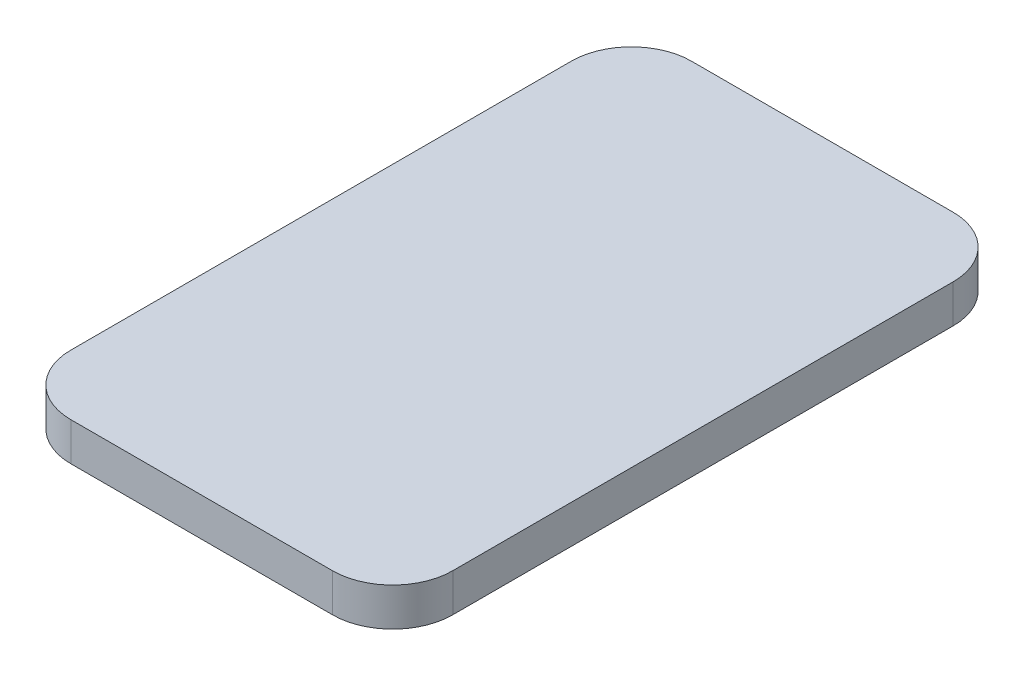
ISO-10303-21;
HEADER;
FILE_DESCRIPTION(('STEP AP214'),'2;1');
FILE_NAME('part.step','',(''),(''),'','','');
FILE_SCHEMA(('AUTOMOTIVE_DESIGN { 1 0 10303 214 1 1 1 1 }'));
ENDSEC;
DATA;
#1=APPLICATION_CONTEXT('core data for automotive mechanical design processes');
#2=APPLICATION_PROTOCOL_DEFINITION('international standard','automotive_design',2000,#1);
#3=PRODUCT_CONTEXT('',#1,'mechanical');
#4=PRODUCT('Part','Part','',(#3));
#5=PRODUCT_RELATED_PRODUCT_CATEGORY('part','',(#4));
#6=PRODUCT_DEFINITION_FORMATION('','',#4);
#7=PRODUCT_DEFINITION_CONTEXT('part definition',#1,'design');
#8=PRODUCT_DEFINITION('design','',#6,#7);
#9=PRODUCT_DEFINITION_SHAPE('','',#8);
#10=(LENGTH_UNIT() NAMED_UNIT(*) SI_UNIT(.MILLI.,.METRE.));
#11=(NAMED_UNIT(*) PLANE_ANGLE_UNIT() SI_UNIT($,.RADIAN.));
#12=(NAMED_UNIT(*) SI_UNIT($,.STERADIAN.) SOLID_ANGLE_UNIT());
#13=UNCERTAINTY_MEASURE_WITH_UNIT(LENGTH_MEASURE(1.E-05),#10,'distance_accuracy_value','');
#14=(GEOMETRIC_REPRESENTATION_CONTEXT(3) GLOBAL_UNCERTAINTY_ASSIGNED_CONTEXT((#13)) GLOBAL_UNIT_ASSIGNED_CONTEXT((#10,
#11,#12)) REPRESENTATION_CONTEXT('',''));
#15=CARTESIAN_POINT('',(0.,0.,0.));
#16=DIRECTION('',(0.,0.,1.));
#17=DIRECTION('',(1.,0.,0.));
#18=AXIS2_PLACEMENT_3D('',#15,#16,#17);
#19=CARTESIAN_POINT('',(27.4,8.,-52.4));
#20=DIRECTION('',(0.,-1.,0.));
#21=DIRECTION('',(0.,0.,-1.));
#22=AXIS2_PLACEMENT_3D('',#19,#20,#21);
#23=CYLINDRICAL_SURFACE('',#22,12.6);
#24=CARTESIAN_POINT('',(27.4,0.,-52.4));
#25=DIRECTION('',(0.,1.,0.));
#26=DIRECTION('',(0.,0.,1.));
#27=AXIS2_PLACEMENT_3D('',#24,#25,#26);
#28=CIRCLE('',#27,12.6);
#29=CARTESIAN_POINT('',(40.,0.,-52.4));
#30=VERTEX_POINT('',#29);
#31=CARTESIAN_POINT('',(27.4,0.,-65.));
#32=VERTEX_POINT('',#31);
#33=EDGE_CURVE('E132',#30,#32,#28,.T.);
#34=ORIENTED_EDGE('',*,*,#33,.T.);
#35=DIRECTION('',(0.,-1.,0.));
#36=VECTOR('',#35,1.);
#37=CARTESIAN_POINT('',(27.4,8.,-65.));
#38=LINE('',#37,#36);
#39=CARTESIAN_POINT('',(27.4,8.,-65.));
#40=VERTEX_POINT('',#39);
#41=EDGE_CURVE('E11',#40,#32,#38,.T.);
#42=ORIENTED_EDGE('',*,*,#41,.F.);
#43=CARTESIAN_POINT('',(27.4,8.,-52.4));
#44=DIRECTION('',(0.,1.,0.));
#45=DIRECTION('',(0.,0.,1.));
#46=AXIS2_PLACEMENT_3D('',#43,#44,#45);
#47=CIRCLE('',#46,12.6);
#48=CARTESIAN_POINT('',(40.,8.,-52.4));
#49=VERTEX_POINT('',#48);
#50=EDGE_CURVE('E146',#49,#40,#47,.T.);
#51=ORIENTED_EDGE('',*,*,#50,.F.);
#52=DIRECTION('',(0.,-1.,0.));
#53=VECTOR('',#52,1.);
#54=CARTESIAN_POINT('',(40.,8.,-52.4));
#55=LINE('',#54,#53);
#56=EDGE_CURVE('E128',#49,#30,#55,.T.);
#57=ORIENTED_EDGE('',*,*,#56,.T.);
#58=EDGE_LOOP('',(#34,#42,#51,#57));
#59=FACE_BOUND('',#58,.T.);
#60=ADVANCED_FACE('F36',(#59),#23,.T.);
#61=CARTESIAN_POINT('',(27.4,8.,-65.));
#62=DIRECTION('',(0.,0.,1.));
#63=DIRECTION('',(1.,0.,0.));
#64=AXIS2_PLACEMENT_3D('',#61,#62,#63);
#65=PLANE('',#64);
#66=DIRECTION('',(-1.,0.,0.));
#67=VECTOR('',#66,1.);
#68=CARTESIAN_POINT('',(27.4,0.,-65.));
#69=LINE('',#68,#67);
#70=CARTESIAN_POINT('',(-27.4,0.,-65.));
#71=VERTEX_POINT('',#70);
#72=EDGE_CURVE('E135',#32,#71,#69,.T.);
#73=ORIENTED_EDGE('',*,*,#72,.T.);
#74=DIRECTION('',(0.,-1.,0.));
#75=VECTOR('',#74,1.);
#76=CARTESIAN_POINT('',(-27.4,8.,-65.));
#77=LINE('',#76,#75);
#78=CARTESIAN_POINT('',(-27.4,8.,-65.));
#79=VERTEX_POINT('',#78);
#80=EDGE_CURVE('E44',#79,#71,#77,.T.);
#81=ORIENTED_EDGE('',*,*,#80,.F.);
#82=DIRECTION('',(-1.,0.,0.));
#83=VECTOR('',#82,1.);
#84=CARTESIAN_POINT('',(27.4,8.,-65.));
#85=LINE('',#84,#83);
#86=EDGE_CURVE('E95',#40,#79,#85,.T.);
#87=ORIENTED_EDGE('',*,*,#86,.F.);
#88=ORIENTED_EDGE('',*,*,#41,.T.);
#89=EDGE_LOOP('',(#73,#81,#87,#88));
#90=FACE_BOUND('',#89,.T.);
#91=ADVANCED_FACE('F181',(#90),#65,.F.);
#92=CARTESIAN_POINT('',(-27.4,8.,-52.4));
#93=DIRECTION('',(0.,-1.,0.));
#94=DIRECTION('',(0.,0.,-1.));
#95=AXIS2_PLACEMENT_3D('',#92,#93,#94);
#96=CYLINDRICAL_SURFACE('',#95,12.6);
#97=CARTESIAN_POINT('',(-27.4,0.,-52.4));
#98=DIRECTION('',(0.,1.,0.));
#99=DIRECTION('',(0.,0.,1.));
#100=AXIS2_PLACEMENT_3D('',#97,#98,#99);
#101=CIRCLE('',#100,12.6);
#102=CARTESIAN_POINT('',(-40.,0.,-52.4));
#103=VERTEX_POINT('',#102);
#104=EDGE_CURVE('E137',#71,#103,#101,.T.);
#105=ORIENTED_EDGE('',*,*,#104,.T.);
#106=DIRECTION('',(0.,-1.,0.));
#107=VECTOR('',#106,1.);
#108=CARTESIAN_POINT('',(-40.,8.,-52.4));
#109=LINE('',#108,#107);
#110=CARTESIAN_POINT('',(-40.,8.,-52.4));
#111=VERTEX_POINT('',#110);
#112=EDGE_CURVE('E153',#111,#103,#109,.T.);
#113=ORIENTED_EDGE('',*,*,#112,.F.);
#114=CARTESIAN_POINT('',(-27.4,8.,-52.4));
#115=DIRECTION('',(0.,1.,0.));
#116=DIRECTION('',(0.,0.,1.));
#117=AXIS2_PLACEMENT_3D('',#114,#115,#116);
#118=CIRCLE('',#117,12.6);
#119=EDGE_CURVE('E161',#79,#111,#118,.T.);
#120=ORIENTED_EDGE('',*,*,#119,.F.);
#121=ORIENTED_EDGE('',*,*,#80,.T.);
#122=EDGE_LOOP('',(#105,#113,#120,#121));
#123=FACE_BOUND('',#122,.T.);
#124=ADVANCED_FACE('F159',(#123),#96,.T.);
#125=CARTESIAN_POINT('',(-40.,8.,52.4));
#126=DIRECTION('',(1.,0.,0.));
#127=DIRECTION('',(0.,0.,-1.));
#128=AXIS2_PLACEMENT_3D('',#125,#126,#127);
#129=PLANE('',#128);
#130=DIRECTION('',(0.,0.,1.));
#131=VECTOR('',#130,1.);
#132=CARTESIAN_POINT('',(-40.,0.,52.4));
#133=LINE('',#132,#131);
#134=CARTESIAN_POINT('',(-40.,0.,52.4));
#135=VERTEX_POINT('',#134);
#136=EDGE_CURVE('E139',#103,#135,#133,.T.);
#137=ORIENTED_EDGE('',*,*,#136,.T.);
#138=DIRECTION('',(0.,-1.,0.));
#139=VECTOR('',#138,1.);
#140=CARTESIAN_POINT('',(-40.,8.,52.4));
#141=LINE('',#140,#139);
#142=CARTESIAN_POINT('',(-40.,8.,52.4));
#143=VERTEX_POINT('',#142);
#144=EDGE_CURVE('E150',#143,#135,#141,.T.);
#145=ORIENTED_EDGE('',*,*,#144,.F.);
#146=DIRECTION('',(0.,0.,1.));
#147=VECTOR('',#146,1.);
#148=CARTESIAN_POINT('',(-40.,8.,52.4));
#149=LINE('',#148,#147);
#150=EDGE_CURVE('E173',#111,#143,#149,.T.);
#151=ORIENTED_EDGE('',*,*,#150,.F.);
#152=ORIENTED_EDGE('',*,*,#112,.T.);
#153=EDGE_LOOP('',(#137,#145,#151,#152));
#154=FACE_BOUND('',#153,.T.);
#155=ADVANCED_FACE('F169',(#154),#129,.F.);
#156=CARTESIAN_POINT('',(-27.4,8.,52.4));
#157=DIRECTION('',(0.,-1.,0.));
#158=DIRECTION('',(0.,0.,-1.));
#159=AXIS2_PLACEMENT_3D('',#156,#157,#158);
#160=CYLINDRICAL_SURFACE('',#159,12.6);
#161=CARTESIAN_POINT('',(-27.4,0.,52.4));
#162=DIRECTION('',(0.,1.,0.));
#163=DIRECTION('',(0.,0.,1.));
#164=AXIS2_PLACEMENT_3D('',#161,#162,#163);
#165=CIRCLE('',#164,12.6);
#166=CARTESIAN_POINT('',(-27.4,0.,65.));
#167=VERTEX_POINT('',#166);
#168=EDGE_CURVE('E141',#135,#167,#165,.T.);
#169=ORIENTED_EDGE('',*,*,#168,.T.);
#170=DIRECTION('',(0.,-1.,0.));
#171=VECTOR('',#170,1.);
#172=CARTESIAN_POINT('',(-27.4,8.,65.));
#173=LINE('',#172,#171);
#174=CARTESIAN_POINT('',(-27.4,8.,65.));
#175=VERTEX_POINT('',#174);
#176=EDGE_CURVE('E123',#175,#167,#173,.T.);
#177=ORIENTED_EDGE('',*,*,#176,.F.);
#178=CARTESIAN_POINT('',(-27.4,8.,52.4));
#179=DIRECTION('',(0.,1.,0.));
#180=DIRECTION('',(0.,0.,1.));
#181=AXIS2_PLACEMENT_3D('',#178,#179,#180);
#182=CIRCLE('',#181,12.6);
#183=EDGE_CURVE('E114',#143,#175,#182,.T.);
#184=ORIENTED_EDGE('',*,*,#183,.F.);
#185=ORIENTED_EDGE('',*,*,#144,.T.);
#186=EDGE_LOOP('',(#169,#177,#184,#185));
#187=FACE_BOUND('',#186,.T.);
#188=ADVANCED_FACE('F172',(#187),#160,.T.);
#189=CARTESIAN_POINT('',(-27.4,8.,65.));
#190=DIRECTION('',(0.,0.,-1.));
#191=DIRECTION('',(-1.,0.,0.));
#192=AXIS2_PLACEMENT_3D('',#189,#190,#191);
#193=PLANE('',#192);
#194=DIRECTION('',(1.,0.,0.));
#195=VECTOR('',#194,1.);
#196=CARTESIAN_POINT('',(-27.4,0.,65.));
#197=LINE('',#196,#195);
#198=CARTESIAN_POINT('',(27.4,0.,65.));
#199=VERTEX_POINT('',#198);
#200=EDGE_CURVE('E122',#167,#199,#197,.T.);
#201=ORIENTED_EDGE('',*,*,#200,.T.);
#202=DIRECTION('',(0.,-1.,0.));
#203=VECTOR('',#202,1.);
#204=CARTESIAN_POINT('',(27.4,8.,65.));
#205=LINE('',#204,#203);
#206=CARTESIAN_POINT('',(27.4,8.,65.));
#207=VERTEX_POINT('',#206);
#208=EDGE_CURVE('E119',#207,#199,#205,.T.);
#209=ORIENTED_EDGE('',*,*,#208,.F.);
#210=DIRECTION('',(1.,0.,0.));
#211=VECTOR('',#210,1.);
#212=CARTESIAN_POINT('',(-27.4,8.,65.));
#213=LINE('',#212,#211);
#214=EDGE_CURVE('E108',#175,#207,#213,.T.);
#215=ORIENTED_EDGE('',*,*,#214,.F.);
#216=ORIENTED_EDGE('',*,*,#176,.T.);
#217=EDGE_LOOP('',(#201,#209,#215,#216));
#218=FACE_BOUND('',#217,.T.);
#219=ADVANCED_FACE('F120',(#218),#193,.F.);
#220=CARTESIAN_POINT('',(27.4,8.,52.4));
#221=DIRECTION('',(0.,-1.,0.));
#222=DIRECTION('',(0.,0.,-1.));
#223=AXIS2_PLACEMENT_3D('',#220,#221,#222);
#224=CYLINDRICAL_SURFACE('',#223,12.6);
#225=CARTESIAN_POINT('',(27.4,0.,52.4));
#226=DIRECTION('',(0.,1.,0.));
#227=DIRECTION('',(0.,0.,1.));
#228=AXIS2_PLACEMENT_3D('',#225,#226,#227);
#229=CIRCLE('',#228,12.6);
#230=CARTESIAN_POINT('',(40.,0.,52.4));
#231=VERTEX_POINT('',#230);
#232=EDGE_CURVE('E81',#199,#231,#229,.T.);
#233=ORIENTED_EDGE('',*,*,#232,.T.);
#234=DIRECTION('',(0.,-1.,0.));
#235=VECTOR('',#234,1.);
#236=CARTESIAN_POINT('',(40.,8.,52.4));
#237=LINE('',#236,#235);
#238=CARTESIAN_POINT('',(40.,8.,52.4));
#239=VERTEX_POINT('',#238);
#240=EDGE_CURVE('E124',#239,#231,#237,.T.);
#241=ORIENTED_EDGE('',*,*,#240,.F.);
#242=CARTESIAN_POINT('',(27.4,8.,52.4));
#243=DIRECTION('',(0.,1.,0.));
#244=DIRECTION('',(0.,0.,1.));
#245=AXIS2_PLACEMENT_3D('',#242,#243,#244);
#246=CIRCLE('',#245,12.6);
#247=EDGE_CURVE('E112',#207,#239,#246,.T.);
#248=ORIENTED_EDGE('',*,*,#247,.F.);
#249=ORIENTED_EDGE('',*,*,#208,.T.);
#250=EDGE_LOOP('',(#233,#241,#248,#249));
#251=FACE_BOUND('',#250,.T.);
#252=ADVANCED_FACE('F126',(#251),#224,.T.);
#253=CARTESIAN_POINT('',(40.,8.,-52.4));
#254=DIRECTION('',(-1.,0.,0.));
#255=DIRECTION('',(0.,0.,1.));
#256=AXIS2_PLACEMENT_3D('',#253,#254,#255);
#257=PLANE('',#256);
#258=DIRECTION('',(0.,0.,-1.));
#259=VECTOR('',#258,1.);
#260=CARTESIAN_POINT('',(40.,0.,-52.4));
#261=LINE('',#260,#259);
#262=EDGE_CURVE('E87',#231,#30,#261,.T.);
#263=ORIENTED_EDGE('',*,*,#262,.T.);
#264=ORIENTED_EDGE('',*,*,#56,.F.);
#265=DIRECTION('',(0.,0.,-1.));
#266=VECTOR('',#265,1.);
#267=CARTESIAN_POINT('',(40.,8.,-52.4));
#268=LINE('',#267,#266);
#269=EDGE_CURVE('E52',#239,#49,#268,.T.);
#270=ORIENTED_EDGE('',*,*,#269,.F.);
#271=ORIENTED_EDGE('',*,*,#240,.T.);
#272=EDGE_LOOP('',(#263,#264,#270,#271));
#273=FACE_BOUND('',#272,.T.);
#274=ADVANCED_FACE('F197',(#273),#257,.F.);
#275=CARTESIAN_POINT('',(27.4,8.,-52.4));
#276=DIRECTION('',(0.,1.,0.));
#277=DIRECTION('',(0.,0.,1.));
#278=AXIS2_PLACEMENT_3D('',#275,#276,#277);
#279=PLANE('',#278);
#280=ORIENTED_EDGE('',*,*,#50,.T.);
#281=ORIENTED_EDGE('',*,*,#86,.T.);
#282=ORIENTED_EDGE('',*,*,#119,.T.);
#283=ORIENTED_EDGE('',*,*,#150,.T.);
#284=ORIENTED_EDGE('',*,*,#183,.T.);
#285=ORIENTED_EDGE('',*,*,#214,.T.);
#286=ORIENTED_EDGE('',*,*,#247,.T.);
#287=ORIENTED_EDGE('',*,*,#269,.T.);
#288=EDGE_LOOP('',(#280,#281,#282,#283,#284,#285,#286,#287));
#289=FACE_BOUND('',#288,.T.);
#290=ADVANCED_FACE('F110',(#289),#279,.T.);
#291=CARTESIAN_POINT('',(27.4,0.,-52.4));
#292=DIRECTION('',(0.,1.,0.));
#293=DIRECTION('',(0.,0.,1.));
#294=AXIS2_PLACEMENT_3D('',#291,#292,#293);
#295=PLANE('',#294);
#296=ORIENTED_EDGE('',*,*,#33,.F.);
#297=ORIENTED_EDGE('',*,*,#262,.F.);
#298=ORIENTED_EDGE('',*,*,#232,.F.);
#299=ORIENTED_EDGE('',*,*,#200,.F.);
#300=ORIENTED_EDGE('',*,*,#168,.F.);
#301=ORIENTED_EDGE('',*,*,#136,.F.);
#302=ORIENTED_EDGE('',*,*,#104,.F.);
#303=ORIENTED_EDGE('',*,*,#72,.F.);
#304=EDGE_LOOP('',(#296,#297,#298,#299,#300,#301,#302,#303));
#305=FACE_BOUND('',#304,.T.);
#306=ADVANCED_FACE('F165',(#305),#295,.F.);
#307=CLOSED_SHELL('',(#60,#91,#124,#155,#188,#219,#252,#274,#290,#306));
#308=MANIFOLD_SOLID_BREP('B2',#307);
#309=ADVANCED_BREP_SHAPE_REPRESENTATION('',(#18,#308),#14);
#310=SHAPE_DEFINITION_REPRESENTATION(#9,#309);
ENDSEC;
END-ISO-10303-21;
